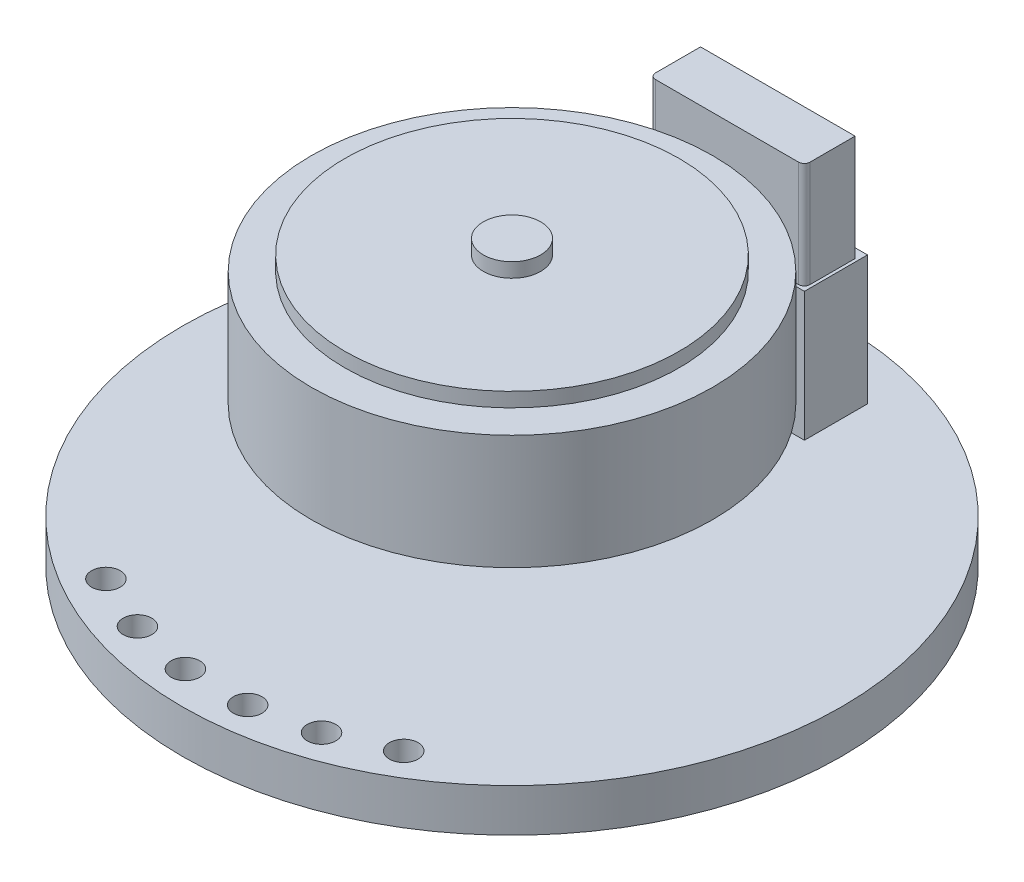
ISO-10303-21;
HEADER;
FILE_DESCRIPTION(('STEP AP214'),'2;1');
FILE_NAME('part.step','',(''),(''),'','','');
FILE_SCHEMA(('AUTOMOTIVE_DESIGN { 1 0 10303 214 1 1 1 1 }'));
ENDSEC;
DATA;
#1=APPLICATION_CONTEXT('core data for automotive mechanical design processes');
#2=APPLICATION_PROTOCOL_DEFINITION('international standard','automotive_design',2000,#1);
#3=PRODUCT_CONTEXT('',#1,'mechanical');
#4=PRODUCT('Part','Part','',(#3));
#5=PRODUCT_RELATED_PRODUCT_CATEGORY('part','',(#4));
#6=PRODUCT_DEFINITION_FORMATION('','',#4);
#7=PRODUCT_DEFINITION_CONTEXT('part definition',#1,'design');
#8=PRODUCT_DEFINITION('design','',#6,#7);
#9=PRODUCT_DEFINITION_SHAPE('','',#8);
#10=(LENGTH_UNIT() NAMED_UNIT(*) SI_UNIT(.MILLI.,.METRE.));
#11=(NAMED_UNIT(*) PLANE_ANGLE_UNIT() SI_UNIT($,.RADIAN.));
#12=(NAMED_UNIT(*) SI_UNIT($,.STERADIAN.) SOLID_ANGLE_UNIT());
#13=UNCERTAINTY_MEASURE_WITH_UNIT(LENGTH_MEASURE(1.E-05),#10,'distance_accuracy_value','');
#14=(GEOMETRIC_REPRESENTATION_CONTEXT(3) GLOBAL_UNCERTAINTY_ASSIGNED_CONTEXT((#13)) GLOBAL_UNIT_ASSIGNED_CONTEXT((#10,
#11,#12)) REPRESENTATION_CONTEXT('',''));
#15=CARTESIAN_POINT('',(0.,0.,0.));
#16=DIRECTION('',(0.,0.,1.));
#17=DIRECTION('',(1.,0.,0.));
#18=AXIS2_PLACEMENT_3D('',#15,#16,#17);
#19=CARTESIAN_POINT('',(0.,9.4,0.));
#20=DIRECTION('',(0.,1.,0.));
#21=DIRECTION('',(0.,0.,1.));
#22=AXIS2_PLACEMENT_3D('',#19,#20,#21);
#23=PLANE('',#22);
#24=CARTESIAN_POINT('',(0.,9.4,0.));
#25=DIRECTION('',(0.,1.,0.));
#26=DIRECTION('',(0.,0.,1.));
#27=AXIS2_PLACEMENT_3D('',#24,#25,#26);
#28=CIRCLE('',#27,5.83000214825466);
#29=CARTESIAN_POINT('',(0.,9.4,5.83000214825466));
#30=VERTEX_POINT('',#29);
#31=EDGE_CURVE('E335',#30,#30,#28,.T.);
#32=ORIENTED_EDGE('',*,*,#31,.T.);
#33=EDGE_LOOP('',(#32));
#34=FACE_BOUND('',#33,.T.);
#35=CARTESIAN_POINT('',(0.,9.4,0.));
#36=DIRECTION('',(0.,1.,0.));
#37=DIRECTION('',(0.,0.,1.));
#38=AXIS2_PLACEMENT_3D('',#35,#36,#37);
#39=CIRCLE('',#38,1.);
#40=CARTESIAN_POINT('',(0.,9.4,1.));
#41=VERTEX_POINT('',#40);
#42=EDGE_CURVE('E342',#41,#41,#39,.T.);
#43=ORIENTED_EDGE('',*,*,#42,.F.);
#44=EDGE_LOOP('',(#43));
#45=FACE_BOUND('',#44,.T.);
#46=ADVANCED_FACE('F35',(#34,#45),#23,.T.);
#47=CARTESIAN_POINT('',(0.,8.9,0.));
#48=DIRECTION('',(0.,1.,0.));
#49=DIRECTION('',(0.,0.,1.));
#50=AXIS2_PLACEMENT_3D('',#47,#48,#49);
#51=PLANE('',#50);
#52=CARTESIAN_POINT('',(0.,8.9,0.));
#53=DIRECTION('',(0.,1.,0.));
#54=DIRECTION('',(0.,0.,1.));
#55=AXIS2_PLACEMENT_3D('',#52,#53,#54);
#56=CIRCLE('',#55,7.);
#57=CARTESIAN_POINT('',(0.,8.9,7.));
#58=VERTEX_POINT('',#57);
#59=EDGE_CURVE('E294',#58,#58,#56,.T.);
#60=ORIENTED_EDGE('',*,*,#59,.T.);
#61=EDGE_LOOP('',(#60));
#62=FACE_BOUND('',#61,.T.);
#63=CARTESIAN_POINT('',(0.,8.9,0.));
#64=DIRECTION('',(0.,1.,0.));
#65=DIRECTION('',(0.,0.,1.));
#66=AXIS2_PLACEMENT_3D('',#63,#64,#65);
#67=CIRCLE('',#66,5.83000214825466);
#68=CARTESIAN_POINT('',(0.,8.9,5.83000214825466));
#69=VERTEX_POINT('',#68);
#70=EDGE_CURVE('E337',#69,#69,#67,.T.);
#71=ORIENTED_EDGE('',*,*,#70,.F.);
#72=EDGE_LOOP('',(#71));
#73=FACE_BOUND('',#72,.T.);
#74=ADVANCED_FACE('F192',(#62,#73),#51,.T.);
#75=CARTESIAN_POINT('',(0.,1.5,0.));
#76=DIRECTION('',(0.,1.,0.));
#77=DIRECTION('',(0.,0.,1.));
#78=AXIS2_PLACEMENT_3D('',#75,#76,#77);
#79=PLANE('',#78);
#80=CARTESIAN_POINT('',(-5.19421202389019,1.5,8.97040407815014));
#81=DIRECTION('',(0.,1.,0.));
#82=DIRECTION('',(0.,0.,1.));
#83=AXIS2_PLACEMENT_3D('',#80,#81,#82);
#84=CIRCLE('',#83,0.500000000000002);
#85=CARTESIAN_POINT('',(-5.19421202389019,1.5,9.47040407815014));
#86=VERTEX_POINT('',#85);
#87=EDGE_CURVE('E262',#86,#86,#84,.T.);
#88=ORIENTED_EDGE('',*,*,#87,.F.);
#89=EDGE_LOOP('',(#88));
#90=FACE_BOUND('',#89,.T.);
#91=CARTESIAN_POINT('',(-3.21019957553751,1.5,9.85374333216596));
#92=DIRECTION('',(0.,1.,0.));
#93=DIRECTION('',(0.,0.,1.));
#94=AXIS2_PLACEMENT_3D('',#91,#92,#93);
#95=CIRCLE('',#94,0.5);
#96=CARTESIAN_POINT('',(-3.21019957553751,1.5,10.353743332166));
#97=VERTEX_POINT('',#96);
#98=EDGE_CURVE('E266',#97,#97,#95,.T.);
#99=ORIENTED_EDGE('',*,*,#98,.F.);
#100=EDGE_LOOP('',(#99));
#101=FACE_BOUND('',#100,.T.);
#102=CARTESIAN_POINT('',(-1.08588600148721,1.5,10.305280121375));
#103=DIRECTION('',(0.,1.,0.));
#104=DIRECTION('',(0.,0.,1.));
#105=AXIS2_PLACEMENT_3D('',#102,#103,#104);
#106=CIRCLE('',#105,0.500000000000008);
#107=CARTESIAN_POINT('',(-1.08588600148721,1.5,10.8052801213751));
#108=VERTEX_POINT('',#107);
#109=EDGE_CURVE('E270',#108,#108,#106,.T.);
#110=ORIENTED_EDGE('',*,*,#109,.F.);
#111=EDGE_LOOP('',(#110));
#112=FACE_BOUND('',#111,.T.);
#113=CARTESIAN_POINT('',(1.08588600148721,1.5,10.3052801213751));
#114=DIRECTION('',(0.,1.,0.));
#115=DIRECTION('',(0.,0.,1.));
#116=AXIS2_PLACEMENT_3D('',#113,#114,#115);
#117=CIRCLE('',#116,0.500000000000034);
#118=CARTESIAN_POINT('',(1.08588600148721,1.5,10.8052801213751));
#119=VERTEX_POINT('',#118);
#120=EDGE_CURVE('E274',#119,#119,#117,.T.);
#121=ORIENTED_EDGE('',*,*,#120,.F.);
#122=EDGE_LOOP('',(#121));
#123=FACE_BOUND('',#122,.T.);
#124=CARTESIAN_POINT('',(3.21019957553754,1.5,9.85374333216591));
#125=DIRECTION('',(0.,1.,0.));
#126=DIRECTION('',(0.,0.,1.));
#127=AXIS2_PLACEMENT_3D('',#124,#125,#126);
#128=CIRCLE('',#127,0.5);
#129=CARTESIAN_POINT('',(3.21019957553754,1.5,10.3537433321659));
#130=VERTEX_POINT('',#129);
#131=EDGE_CURVE('E278',#130,#130,#128,.T.);
#132=ORIENTED_EDGE('',*,*,#131,.F.);
#133=EDGE_LOOP('',(#132));
#134=FACE_BOUND('',#133,.T.);
#135=CARTESIAN_POINT('',(5.19421202389015,1.5,8.97040407815016));
#136=DIRECTION('',(0.,1.,0.));
#137=DIRECTION('',(0.,0.,1.));
#138=AXIS2_PLACEMENT_3D('',#135,#136,#137);
#139=CIRCLE('',#138,0.500000000000079);
#140=CARTESIAN_POINT('',(5.19421202389015,1.5,9.47040407815024));
#141=VERTEX_POINT('',#140);
#142=EDGE_CURVE('E282',#141,#141,#139,.T.);
#143=ORIENTED_EDGE('',*,*,#142,.F.);
#144=EDGE_LOOP('',(#143));
#145=FACE_BOUND('',#144,.T.);
#146=DIRECTION('',(-1.,0.,0.));
#147=VECTOR('',#146,1.);
#148=CARTESIAN_POINT('',(-2.8,1.5,-9.6));
#149=LINE('',#148,#147);
#150=CARTESIAN_POINT('',(2.8,1.5,-9.6));
#151=VERTEX_POINT('',#150);
#152=CARTESIAN_POINT('',(-2.8,1.5,-9.6));
#153=VERTEX_POINT('',#152);
#154=EDGE_CURVE('E141',#151,#153,#149,.T.);
#155=ORIENTED_EDGE('',*,*,#154,.F.);
#156=DIRECTION('',(0.,0.,-1.));
#157=VECTOR('',#156,1.);
#158=CARTESIAN_POINT('',(2.8,1.5,-9.6));
#159=LINE('',#158,#157);
#160=CARTESIAN_POINT('',(2.8,1.5,-7.4));
#161=VERTEX_POINT('',#160);
#162=EDGE_CURVE('E138',#161,#151,#159,.T.);
#163=ORIENTED_EDGE('',*,*,#162,.F.);
#164=DIRECTION('',(1.,0.,0.));
#165=VECTOR('',#164,1.);
#166=CARTESIAN_POINT('',(-2.8,1.5,-7.4));
#167=LINE('',#166,#165);
#168=CARTESIAN_POINT('',(-2.8,1.5,-7.4));
#169=VERTEX_POINT('',#168);
#170=EDGE_CURVE('E151',#169,#161,#167,.T.);
#171=ORIENTED_EDGE('',*,*,#170,.F.);
#172=DIRECTION('',(0.,0.,1.));
#173=VECTOR('',#172,1.);
#174=CARTESIAN_POINT('',(-2.8,1.5,-9.6));
#175=LINE('',#174,#173);
#176=EDGE_CURVE('E159',#153,#169,#175,.T.);
#177=ORIENTED_EDGE('',*,*,#176,.F.);
#178=EDGE_LOOP('',(#155,#163,#171,#177));
#179=FACE_BOUND('',#178,.T.);
#180=CARTESIAN_POINT('',(0.,1.5,0.));
#181=DIRECTION('',(0.,1.,0.));
#182=DIRECTION('',(0.,0.,1.));
#183=AXIS2_PLACEMENT_3D('',#180,#181,#182);
#184=CIRCLE('',#183,11.5);
#185=CARTESIAN_POINT('',(0.,1.5,11.5));
#186=VERTEX_POINT('',#185);
#187=EDGE_CURVE('E11',#186,#186,#184,.T.);
#188=ORIENTED_EDGE('',*,*,#187,.T.);
#189=EDGE_LOOP('',(#188));
#190=FACE_BOUND('',#189,.T.);
#191=CARTESIAN_POINT('',(0.,1.5,0.));
#192=DIRECTION('',(0.,1.,0.));
#193=DIRECTION('',(0.,0.,1.));
#194=AXIS2_PLACEMENT_3D('',#191,#192,#193);
#195=CIRCLE('',#194,1.);
#196=CARTESIAN_POINT('',(0.,1.5,1.));
#197=VERTEX_POINT('',#196);
#198=EDGE_CURVE('E291',#197,#197,#195,.T.);
#199=ORIENTED_EDGE('',*,*,#198,.F.);
#200=EDGE_LOOP('',(#199));
#201=FACE_BOUND('',#200,.T.);
#202=ADVANCED_FACE('F198',(#90,#101,#112,#123,#134,#145,#179,#190,#201),#79,.T.);
#203=CARTESIAN_POINT('',(0.,6.,0.));
#204=DIRECTION('',(0.,1.,0.));
#205=DIRECTION('',(0.,0.,1.));
#206=AXIS2_PLACEMENT_3D('',#203,#204,#205);
#207=PLANE('',#206);
#208=DIRECTION('',(0.,0.,-1.));
#209=VECTOR('',#208,1.);
#210=CARTESIAN_POINT('',(2.8,6.,-9.6));
#211=LINE('',#210,#209);
#212=CARTESIAN_POINT('',(2.8,6.,-7.4));
#213=VERTEX_POINT('',#212);
#214=CARTESIAN_POINT('',(2.8,6.,-9.6));
#215=VERTEX_POINT('',#214);
#216=EDGE_CURVE('E147',#213,#215,#211,.T.);
#217=ORIENTED_EDGE('',*,*,#216,.T.);
#218=DIRECTION('',(-1.,0.,0.));
#219=VECTOR('',#218,1.);
#220=CARTESIAN_POINT('',(-2.8,6.,-9.6));
#221=LINE('',#220,#219);
#222=CARTESIAN_POINT('',(-2.8,6.,-9.6));
#223=VERTEX_POINT('',#222);
#224=EDGE_CURVE('E150',#215,#223,#221,.T.);
#225=ORIENTED_EDGE('',*,*,#224,.T.);
#226=DIRECTION('',(0.,0.,1.));
#227=VECTOR('',#226,1.);
#228=CARTESIAN_POINT('',(-2.8,6.,-9.6));
#229=LINE('',#228,#227);
#230=CARTESIAN_POINT('',(-2.8,6.,-7.4));
#231=VERTEX_POINT('',#230);
#232=EDGE_CURVE('E153',#223,#231,#229,.T.);
#233=ORIENTED_EDGE('',*,*,#232,.T.);
#234=DIRECTION('',(1.,0.,0.));
#235=VECTOR('',#234,1.);
#236=CARTESIAN_POINT('',(-2.8,6.,-7.4));
#237=LINE('',#236,#235);
#238=EDGE_CURVE('E155',#231,#213,#237,.T.);
#239=ORIENTED_EDGE('',*,*,#238,.T.);
#240=EDGE_LOOP('',(#217,#225,#233,#239));
#241=FACE_BOUND('',#240,.T.);
#242=CARTESIAN_POINT('',(-2.49514699365122,6.,-7.7));
#243=DIRECTION('',(0.,1.,0.));
#244=DIRECTION('',(0.,0.,1.));
#245=AXIS2_PLACEMENT_3D('',#242,#243,#244);
#246=CIRCLE('',#245,0.2);
#247=CARTESIAN_POINT('',(-2.69514699365122,6.,-7.7));
#248=VERTEX_POINT('',#247);
#249=CARTESIAN_POINT('',(-2.49514699365122,6.,-7.5));
#250=VERTEX_POINT('',#249);
#251=EDGE_CURVE('E311',#248,#250,#246,.T.);
#252=ORIENTED_EDGE('',*,*,#251,.F.);
#253=DIRECTION('',(0.,0.,1.));
#254=VECTOR('',#253,1.);
#255=CARTESIAN_POINT('',(-2.69514699365122,6.,-9.27152586413851));
#256=LINE('',#255,#254);
#257=CARTESIAN_POINT('',(-2.69514699365122,6.,-9.27152586413851));
#258=VERTEX_POINT('',#257);
#259=EDGE_CURVE('E136',#258,#248,#256,.T.);
#260=ORIENTED_EDGE('',*,*,#259,.F.);
#261=DIRECTION('',(-1.,0.,0.));
#262=VECTOR('',#261,1.);
#263=CARTESIAN_POINT('',(-2.69514699365122,6.,-9.27152586413851));
#264=LINE('',#263,#262);
#265=CARTESIAN_POINT('',(2.69514699365121,6.,-9.27152586413851));
#266=VERTEX_POINT('',#265);
#267=EDGE_CURVE('E132',#266,#258,#264,.T.);
#268=ORIENTED_EDGE('',*,*,#267,.F.);
#269=DIRECTION('',(0.,0.,-1.));
#270=VECTOR('',#269,1.);
#271=CARTESIAN_POINT('',(2.69514699365121,6.,-9.27152586413851));
#272=LINE('',#271,#270);
#273=CARTESIAN_POINT('',(2.69514699365121,6.,-7.7));
#274=VERTEX_POINT('',#273);
#275=EDGE_CURVE('E317',#274,#266,#272,.T.);
#276=ORIENTED_EDGE('',*,*,#275,.F.);
#277=CARTESIAN_POINT('',(2.49514699365121,6.,-7.7));
#278=DIRECTION('',(0.,1.,0.));
#279=DIRECTION('',(0.,0.,1.));
#280=AXIS2_PLACEMENT_3D('',#277,#278,#279);
#281=CIRCLE('',#280,0.2);
#282=CARTESIAN_POINT('',(2.49514699365121,6.,-7.5));
#283=VERTEX_POINT('',#282);
#284=EDGE_CURVE('E315',#283,#274,#281,.T.);
#285=ORIENTED_EDGE('',*,*,#284,.F.);
#286=DIRECTION('',(1.,0.,0.));
#287=VECTOR('',#286,1.);
#288=CARTESIAN_POINT('',(-2.49514699365122,6.,-7.5));
#289=LINE('',#288,#287);
#290=EDGE_CURVE('E313',#250,#283,#289,.T.);
#291=ORIENTED_EDGE('',*,*,#290,.F.);
#292=EDGE_LOOP('',(#252,#260,#268,#276,#285,#291));
#293=FACE_BOUND('',#292,.T.);
#294=ADVANCED_FACE('F186',(#241,#293),#207,.T.);
#295=CARTESIAN_POINT('',(0.,1.5,0.));
#296=DIRECTION('',(0.,-1.,0.));
#297=DIRECTION('',(0.,0.,-1.));
#298=AXIS2_PLACEMENT_3D('',#295,#296,#297);
#299=CYLINDRICAL_SURFACE('',#298,11.5);
#300=ORIENTED_EDGE('',*,*,#187,.F.);
#301=EDGE_LOOP('',(#300));
#302=FACE_BOUND('',#301,.T.);
#303=CARTESIAN_POINT('',(0.,0.,0.));
#304=DIRECTION('',(0.,1.,0.));
#305=DIRECTION('',(0.,0.,1.));
#306=AXIS2_PLACEMENT_3D('',#303,#304,#305);
#307=CIRCLE('',#306,11.5);
#308=CARTESIAN_POINT('',(0.,0.,11.5));
#309=VERTEX_POINT('',#308);
#310=EDGE_CURVE('E39',#309,#309,#307,.T.);
#311=ORIENTED_EDGE('',*,*,#310,.T.);
#312=EDGE_LOOP('',(#311));
#313=FACE_BOUND('',#312,.T.);
#314=ADVANCED_FACE('F37',(#302,#313),#299,.T.);
#315=CARTESIAN_POINT('',(0.,0.,0.));
#316=DIRECTION('',(0.,1.,0.));
#317=DIRECTION('',(0.,0.,1.));
#318=AXIS2_PLACEMENT_3D('',#315,#316,#317);
#319=PLANE('',#318);
#320=CARTESIAN_POINT('',(-5.19421202389019,0.,8.97040407815014));
#321=DIRECTION('',(0.,1.,0.));
#322=DIRECTION('',(0.,0.,1.));
#323=AXIS2_PLACEMENT_3D('',#320,#321,#322);
#324=CIRCLE('',#323,0.500000000000002);
#325=CARTESIAN_POINT('',(-5.19421202389019,0.,9.47040407815014));
#326=VERTEX_POINT('',#325);
#327=EDGE_CURVE('E365',#326,#326,#324,.T.);
#328=ORIENTED_EDGE('',*,*,#327,.T.);
#329=EDGE_LOOP('',(#328));
#330=FACE_BOUND('',#329,.T.);
#331=CARTESIAN_POINT('',(-3.21019957553751,0.,9.85374333216596));
#332=DIRECTION('',(0.,1.,0.));
#333=DIRECTION('',(0.,0.,1.));
#334=AXIS2_PLACEMENT_3D('',#331,#332,#333);
#335=CIRCLE('',#334,0.5);
#336=CARTESIAN_POINT('',(-3.21019957553751,0.,10.353743332166));
#337=VERTEX_POINT('',#336);
#338=EDGE_CURVE('E361',#337,#337,#335,.T.);
#339=ORIENTED_EDGE('',*,*,#338,.T.);
#340=EDGE_LOOP('',(#339));
#341=FACE_BOUND('',#340,.T.);
#342=CARTESIAN_POINT('',(-1.08588600148721,0.,10.305280121375));
#343=DIRECTION('',(0.,1.,0.));
#344=DIRECTION('',(0.,0.,1.));
#345=AXIS2_PLACEMENT_3D('',#342,#343,#344);
#346=CIRCLE('',#345,0.500000000000008);
#347=CARTESIAN_POINT('',(-1.08588600148721,0.,10.8052801213751));
#348=VERTEX_POINT('',#347);
#349=EDGE_CURVE('E357',#348,#348,#346,.T.);
#350=ORIENTED_EDGE('',*,*,#349,.T.);
#351=EDGE_LOOP('',(#350));
#352=FACE_BOUND('',#351,.T.);
#353=CARTESIAN_POINT('',(1.08588600148721,0.,10.3052801213751));
#354=DIRECTION('',(0.,1.,0.));
#355=DIRECTION('',(0.,0.,1.));
#356=AXIS2_PLACEMENT_3D('',#353,#354,#355);
#357=CIRCLE('',#356,0.500000000000034);
#358=CARTESIAN_POINT('',(1.08588600148721,0.,10.8052801213751));
#359=VERTEX_POINT('',#358);
#360=EDGE_CURVE('E353',#359,#359,#357,.T.);
#361=ORIENTED_EDGE('',*,*,#360,.T.);
#362=EDGE_LOOP('',(#361));
#363=FACE_BOUND('',#362,.T.);
#364=CARTESIAN_POINT('',(3.21019957553754,0.,9.85374333216591));
#365=DIRECTION('',(0.,1.,0.));
#366=DIRECTION('',(0.,0.,1.));
#367=AXIS2_PLACEMENT_3D('',#364,#365,#366);
#368=CIRCLE('',#367,0.5);
#369=CARTESIAN_POINT('',(3.21019957553754,0.,10.3537433321659));
#370=VERTEX_POINT('',#369);
#371=EDGE_CURVE('E349',#370,#370,#368,.T.);
#372=ORIENTED_EDGE('',*,*,#371,.T.);
#373=EDGE_LOOP('',(#372));
#374=FACE_BOUND('',#373,.T.);
#375=CARTESIAN_POINT('',(5.19421202389015,0.,8.97040407815016));
#376=DIRECTION('',(0.,1.,0.));
#377=DIRECTION('',(0.,0.,1.));
#378=AXIS2_PLACEMENT_3D('',#375,#376,#377);
#379=CIRCLE('',#378,0.500000000000079);
#380=CARTESIAN_POINT('',(5.19421202389015,0.,9.47040407815024));
#381=VERTEX_POINT('',#380);
#382=EDGE_CURVE('E345',#381,#381,#379,.T.);
#383=ORIENTED_EDGE('',*,*,#382,.T.);
#384=EDGE_LOOP('',(#383));
#385=FACE_BOUND('',#384,.T.);
#386=ORIENTED_EDGE('',*,*,#310,.F.);
#387=EDGE_LOOP('',(#386));
#388=FACE_BOUND('',#387,.T.);
#389=ADVANCED_FACE('F175',(#330,#341,#352,#363,#374,#385,#388),#319,.F.);
#390=CARTESIAN_POINT('',(2.8,6.,-9.6));
#391=DIRECTION('',(-1.,0.,0.));
#392=DIRECTION('',(0.,0.,1.));
#393=AXIS2_PLACEMENT_3D('',#390,#391,#392);
#394=PLANE('',#393);
#395=ORIENTED_EDGE('',*,*,#162,.T.);
#396=DIRECTION('',(0.,-1.,0.));
#397=VECTOR('',#396,1.);
#398=CARTESIAN_POINT('',(2.8,6.,-9.6));
#399=LINE('',#398,#397);
#400=EDGE_CURVE('E168',#215,#151,#399,.T.);
#401=ORIENTED_EDGE('',*,*,#400,.F.);
#402=ORIENTED_EDGE('',*,*,#216,.F.);
#403=DIRECTION('',(0.,-1.,0.));
#404=VECTOR('',#403,1.);
#405=CARTESIAN_POINT('',(2.8,6.,-7.4));
#406=LINE('',#405,#404);
#407=EDGE_CURVE('E156',#213,#161,#406,.T.);
#408=ORIENTED_EDGE('',*,*,#407,.T.);
#409=EDGE_LOOP('',(#395,#401,#402,#408));
#410=FACE_BOUND('',#409,.T.);
#411=ADVANCED_FACE('F177',(#410),#394,.F.);
#412=CARTESIAN_POINT('',(-2.8,6.,-9.6));
#413=DIRECTION('',(0.,0.,1.));
#414=DIRECTION('',(1.,0.,0.));
#415=AXIS2_PLACEMENT_3D('',#412,#413,#414);
#416=PLANE('',#415);
#417=ORIENTED_EDGE('',*,*,#154,.T.);
#418=DIRECTION('',(0.,-1.,0.));
#419=VECTOR('',#418,1.);
#420=CARTESIAN_POINT('',(-2.8,6.,-9.6));
#421=LINE('',#420,#419);
#422=EDGE_CURVE('E165',#223,#153,#421,.T.);
#423=ORIENTED_EDGE('',*,*,#422,.F.);
#424=ORIENTED_EDGE('',*,*,#224,.F.);
#425=ORIENTED_EDGE('',*,*,#400,.T.);
#426=EDGE_LOOP('',(#417,#423,#424,#425));
#427=FACE_BOUND('',#426,.T.);
#428=ADVANCED_FACE('F183',(#427),#416,.F.);
#429=CARTESIAN_POINT('',(-2.8,6.,-9.6));
#430=DIRECTION('',(1.,0.,0.));
#431=DIRECTION('',(0.,0.,-1.));
#432=AXIS2_PLACEMENT_3D('',#429,#430,#431);
#433=PLANE('',#432);
#434=ORIENTED_EDGE('',*,*,#176,.T.);
#435=DIRECTION('',(0.,-1.,0.));
#436=VECTOR('',#435,1.);
#437=CARTESIAN_POINT('',(-2.8,6.,-7.4));
#438=LINE('',#437,#436);
#439=EDGE_CURVE('E58',#231,#169,#438,.T.);
#440=ORIENTED_EDGE('',*,*,#439,.F.);
#441=ORIENTED_EDGE('',*,*,#232,.F.);
#442=ORIENTED_EDGE('',*,*,#422,.T.);
#443=EDGE_LOOP('',(#434,#440,#441,#442));
#444=FACE_BOUND('',#443,.T.);
#445=ADVANCED_FACE('F250',(#444),#433,.F.);
#446=CARTESIAN_POINT('',(-2.8,6.,-7.4));
#447=DIRECTION('',(0.,0.,-1.));
#448=DIRECTION('',(-1.,0.,0.));
#449=AXIS2_PLACEMENT_3D('',#446,#447,#448);
#450=PLANE('',#449);
#451=ORIENTED_EDGE('',*,*,#170,.T.);
#452=ORIENTED_EDGE('',*,*,#407,.F.);
#453=ORIENTED_EDGE('',*,*,#238,.F.);
#454=ORIENTED_EDGE('',*,*,#439,.T.);
#455=EDGE_LOOP('',(#451,#452,#453,#454));
#456=FACE_BOUND('',#455,.T.);
#457=ADVANCED_FACE('F244',(#456),#450,.F.);
#458=CARTESIAN_POINT('',(-2.69514699365122,9.7,-9.27152586413851));
#459=DIRECTION('',(1.,0.,0.));
#460=DIRECTION('',(0.,0.,-1.));
#461=AXIS2_PLACEMENT_3D('',#458,#459,#460);
#462=PLANE('',#461);
#463=ORIENTED_EDGE('',*,*,#259,.T.);
#464=DIRECTION('',(0.,-1.,0.));
#465=VECTOR('',#464,1.);
#466=CARTESIAN_POINT('',(-2.69514699365122,9.7,-7.7));
#467=LINE('',#466,#465);
#468=CARTESIAN_POINT('',(-2.69514699365122,9.7,-7.7));
#469=VERTEX_POINT('',#468);
#470=EDGE_CURVE('E117',#469,#248,#467,.T.);
#471=ORIENTED_EDGE('',*,*,#470,.F.);
#472=DIRECTION('',(0.,0.,1.));
#473=VECTOR('',#472,1.);
#474=CARTESIAN_POINT('',(-2.69514699365122,9.7,-9.27152586413851));
#475=LINE('',#474,#473);
#476=CARTESIAN_POINT('',(-2.69514699365122,9.7,-9.27152586413851));
#477=VERTEX_POINT('',#476);
#478=EDGE_CURVE('E124',#477,#469,#475,.T.);
#479=ORIENTED_EDGE('',*,*,#478,.F.);
#480=DIRECTION('',(0.,-1.,0.));
#481=VECTOR('',#480,1.);
#482=CARTESIAN_POINT('',(-2.69514699365122,9.7,-9.27152586413851));
#483=LINE('',#482,#481);
#484=EDGE_CURVE('E309',#477,#258,#483,.T.);
#485=ORIENTED_EDGE('',*,*,#484,.T.);
#486=EDGE_LOOP('',(#463,#471,#479,#485));
#487=FACE_BOUND('',#486,.T.);
#488=ADVANCED_FACE('F134',(#487),#462,.F.);
#489=CARTESIAN_POINT('',(-2.49514699365122,9.7,-7.7));
#490=DIRECTION('',(0.,-1.,0.));
#491=DIRECTION('',(0.,0.,-1.));
#492=AXIS2_PLACEMENT_3D('',#489,#490,#491);
#493=CYLINDRICAL_SURFACE('',#492,0.2);
#494=ORIENTED_EDGE('',*,*,#251,.T.);
#495=DIRECTION('',(0.,-1.,0.));
#496=VECTOR('',#495,1.);
#497=CARTESIAN_POINT('',(-2.49514699365122,9.7,-7.5));
#498=LINE('',#497,#496);
#499=CARTESIAN_POINT('',(-2.49514699365122,9.7,-7.5));
#500=VERTEX_POINT('',#499);
#501=EDGE_CURVE('E120',#500,#250,#498,.T.);
#502=ORIENTED_EDGE('',*,*,#501,.F.);
#503=CARTESIAN_POINT('',(-2.49514699365122,9.7,-7.7));
#504=DIRECTION('',(0.,1.,0.));
#505=DIRECTION('',(0.,0.,1.));
#506=AXIS2_PLACEMENT_3D('',#503,#504,#505);
#507=CIRCLE('',#506,0.2);
#508=EDGE_CURVE('E113',#469,#500,#507,.T.);
#509=ORIENTED_EDGE('',*,*,#508,.F.);
#510=ORIENTED_EDGE('',*,*,#470,.T.);
#511=EDGE_LOOP('',(#494,#502,#509,#510));
#512=FACE_BOUND('',#511,.T.);
#513=ADVANCED_FACE('F115',(#512),#493,.T.);
#514=CARTESIAN_POINT('',(-2.49514699365122,9.7,-7.5));
#515=DIRECTION('',(0.,0.,-1.));
#516=DIRECTION('',(-1.,0.,0.));
#517=AXIS2_PLACEMENT_3D('',#514,#515,#516);
#518=PLANE('',#517);
#519=ORIENTED_EDGE('',*,*,#290,.T.);
#520=DIRECTION('',(0.,-1.,0.));
#521=VECTOR('',#520,1.);
#522=CARTESIAN_POINT('',(2.49514699365121,9.7,-7.5));
#523=LINE('',#522,#521);
#524=CARTESIAN_POINT('',(2.49514699365121,9.7,-7.5));
#525=VERTEX_POINT('',#524);
#526=EDGE_CURVE('E143',#525,#283,#523,.T.);
#527=ORIENTED_EDGE('',*,*,#526,.F.);
#528=DIRECTION('',(1.,0.,0.));
#529=VECTOR('',#528,1.);
#530=CARTESIAN_POINT('',(-2.49514699365122,9.7,-7.5));
#531=LINE('',#530,#529);
#532=EDGE_CURVE('E123',#500,#525,#531,.T.);
#533=ORIENTED_EDGE('',*,*,#532,.F.);
#534=ORIENTED_EDGE('',*,*,#501,.T.);
#535=EDGE_LOOP('',(#519,#527,#533,#534));
#536=FACE_BOUND('',#535,.T.);
#537=ADVANCED_FACE('F235',(#536),#518,.F.);
#538=CARTESIAN_POINT('',(2.49514699365121,9.7,-7.7));
#539=DIRECTION('',(0.,-1.,0.));
#540=DIRECTION('',(0.,0.,-1.));
#541=AXIS2_PLACEMENT_3D('',#538,#539,#540);
#542=CYLINDRICAL_SURFACE('',#541,0.2);
#543=ORIENTED_EDGE('',*,*,#284,.T.);
#544=DIRECTION('',(0.,-1.,0.));
#545=VECTOR('',#544,1.);
#546=CARTESIAN_POINT('',(2.69514699365121,9.7,-7.7));
#547=LINE('',#546,#545);
#548=CARTESIAN_POINT('',(2.69514699365121,9.7,-7.7));
#549=VERTEX_POINT('',#548);
#550=EDGE_CURVE('E322',#549,#274,#547,.T.);
#551=ORIENTED_EDGE('',*,*,#550,.F.);
#552=CARTESIAN_POINT('',(2.49514699365121,9.7,-7.7));
#553=DIRECTION('',(0.,1.,0.));
#554=DIRECTION('',(0.,0.,1.));
#555=AXIS2_PLACEMENT_3D('',#552,#553,#554);
#556=CIRCLE('',#555,0.2);
#557=EDGE_CURVE('E304',#525,#549,#556,.T.);
#558=ORIENTED_EDGE('',*,*,#557,.F.);
#559=ORIENTED_EDGE('',*,*,#526,.T.);
#560=EDGE_LOOP('',(#543,#551,#558,#559));
#561=FACE_BOUND('',#560,.T.);
#562=ADVANCED_FACE('F231',(#561),#542,.T.);
#563=CARTESIAN_POINT('',(2.69514699365121,9.7,-9.27152586413851));
#564=DIRECTION('',(-1.,0.,0.));
#565=DIRECTION('',(0.,0.,1.));
#566=AXIS2_PLACEMENT_3D('',#563,#564,#565);
#567=PLANE('',#566);
#568=ORIENTED_EDGE('',*,*,#275,.T.);
#569=DIRECTION('',(0.,-1.,0.));
#570=VECTOR('',#569,1.);
#571=CARTESIAN_POINT('',(2.69514699365121,9.7,-9.27152586413851));
#572=LINE('',#571,#570);
#573=CARTESIAN_POINT('',(2.69514699365121,9.7,-9.27152586413851));
#574=VERTEX_POINT('',#573);
#575=EDGE_CURVE('E50',#574,#266,#572,.T.);
#576=ORIENTED_EDGE('',*,*,#575,.F.);
#577=DIRECTION('',(0.,0.,-1.));
#578=VECTOR('',#577,1.);
#579=CARTESIAN_POINT('',(2.69514699365121,9.7,-9.27152586413851));
#580=LINE('',#579,#578);
#581=EDGE_CURVE('E306',#549,#574,#580,.T.);
#582=ORIENTED_EDGE('',*,*,#581,.F.);
#583=ORIENTED_EDGE('',*,*,#550,.T.);
#584=EDGE_LOOP('',(#568,#576,#582,#583));
#585=FACE_BOUND('',#584,.T.);
#586=ADVANCED_FACE('F228',(#585),#567,.F.);
#587=CARTESIAN_POINT('',(-2.69514699365122,9.7,-9.27152586413851));
#588=DIRECTION('',(0.,0.,1.));
#589=DIRECTION('',(1.,0.,0.));
#590=AXIS2_PLACEMENT_3D('',#587,#588,#589);
#591=PLANE('',#590);
#592=ORIENTED_EDGE('',*,*,#267,.T.);
#593=ORIENTED_EDGE('',*,*,#484,.F.);
#594=DIRECTION('',(-1.,0.,0.));
#595=VECTOR('',#594,1.);
#596=CARTESIAN_POINT('',(-2.69514699365122,9.7,-9.27152586413851));
#597=LINE('',#596,#595);
#598=EDGE_CURVE('E128',#574,#477,#597,.T.);
#599=ORIENTED_EDGE('',*,*,#598,.F.);
#600=ORIENTED_EDGE('',*,*,#575,.T.);
#601=EDGE_LOOP('',(#592,#593,#599,#600));
#602=FACE_BOUND('',#601,.T.);
#603=ADVANCED_FACE('F225',(#602),#591,.F.);
#604=CARTESIAN_POINT('',(-2.49514699365122,9.7,-7.7));
#605=DIRECTION('',(0.,1.,0.));
#606=DIRECTION('',(0.,0.,1.));
#607=AXIS2_PLACEMENT_3D('',#604,#605,#606);
#608=PLANE('',#607);
#609=ORIENTED_EDGE('',*,*,#478,.T.);
#610=ORIENTED_EDGE('',*,*,#508,.T.);
#611=ORIENTED_EDGE('',*,*,#532,.T.);
#612=ORIENTED_EDGE('',*,*,#557,.T.);
#613=ORIENTED_EDGE('',*,*,#581,.T.);
#614=ORIENTED_EDGE('',*,*,#598,.T.);
#615=EDGE_LOOP('',(#609,#610,#611,#612,#613,#614));
#616=FACE_BOUND('',#615,.T.);
#617=ADVANCED_FACE('F127',(#616),#608,.T.);
#618=CARTESIAN_POINT('',(0.,4.9,0.));
#619=DIRECTION('',(0.,-1.,0.));
#620=DIRECTION('',(0.,0.,-1.));
#621=AXIS2_PLACEMENT_3D('',#618,#619,#620);
#622=CYLINDRICAL_SURFACE('',#621,1.);
#623=CARTESIAN_POINT('',(0.,4.9,0.));
#624=DIRECTION('',(0.,1.,0.));
#625=DIRECTION('',(0.,0.,1.));
#626=AXIS2_PLACEMENT_3D('',#623,#624,#625);
#627=CIRCLE('',#626,1.);
#628=CARTESIAN_POINT('',(0.,4.9,1.));
#629=VERTEX_POINT('',#628);
#630=EDGE_CURVE('E293',#629,#629,#627,.T.);
#631=ORIENTED_EDGE('',*,*,#630,.F.);
#632=EDGE_LOOP('',(#631));
#633=FACE_BOUND('',#632,.T.);
#634=ORIENTED_EDGE('',*,*,#198,.T.);
#635=EDGE_LOOP('',(#634));
#636=FACE_BOUND('',#635,.T.);
#637=ADVANCED_FACE('F215',(#633,#636),#622,.T.);
#638=CARTESIAN_POINT('',(0.,4.9,0.));
#639=DIRECTION('',(0.,1.,0.));
#640=DIRECTION('',(0.,0.,1.));
#641=AXIS2_PLACEMENT_3D('',#638,#639,#640);
#642=PLANE('',#641);
#643=CARTESIAN_POINT('',(0.,4.9,0.));
#644=DIRECTION('',(0.,1.,0.));
#645=DIRECTION('',(0.,0.,1.));
#646=AXIS2_PLACEMENT_3D('',#643,#644,#645);
#647=CIRCLE('',#646,7.);
#648=CARTESIAN_POINT('',(0.,4.9,7.));
#649=VERTEX_POINT('',#648);
#650=EDGE_CURVE('E299',#649,#649,#647,.T.);
#651=ORIENTED_EDGE('',*,*,#650,.F.);
#652=EDGE_LOOP('',(#651));
#653=FACE_BOUND('',#652,.T.);
#654=ORIENTED_EDGE('',*,*,#630,.T.);
#655=EDGE_LOOP('',(#654));
#656=FACE_BOUND('',#655,.T.);
#657=ADVANCED_FACE('F212',(#653,#656),#642,.F.);
#658=CARTESIAN_POINT('',(0.,8.9,0.));
#659=DIRECTION('',(0.,-1.,0.));
#660=DIRECTION('',(0.,0.,-1.));
#661=AXIS2_PLACEMENT_3D('',#658,#659,#660);
#662=CYLINDRICAL_SURFACE('',#661,7.);
#663=ORIENTED_EDGE('',*,*,#59,.F.);
#664=EDGE_LOOP('',(#663));
#665=FACE_BOUND('',#664,.T.);
#666=ORIENTED_EDGE('',*,*,#650,.T.);
#667=EDGE_LOOP('',(#666));
#668=FACE_BOUND('',#667,.T.);
#669=ADVANCED_FACE('F209',(#665,#668),#662,.T.);
#670=CARTESIAN_POINT('',(0.,9.4,0.));
#671=DIRECTION('',(0.,-1.,0.));
#672=DIRECTION('',(0.,0.,-1.));
#673=AXIS2_PLACEMENT_3D('',#670,#671,#672);
#674=CYLINDRICAL_SURFACE('',#673,5.83000214825466);
#675=ORIENTED_EDGE('',*,*,#31,.F.);
#676=EDGE_LOOP('',(#675));
#677=FACE_BOUND('',#676,.T.);
#678=ORIENTED_EDGE('',*,*,#70,.T.);
#679=EDGE_LOOP('',(#678));
#680=FACE_BOUND('',#679,.T.);
#681=ADVANCED_FACE('F207',(#677,#680),#674,.T.);
#682=CARTESIAN_POINT('',(0.,9.9,0.));
#683=DIRECTION('',(0.,-1.,0.));
#684=DIRECTION('',(0.,0.,-1.));
#685=AXIS2_PLACEMENT_3D('',#682,#683,#684);
#686=CYLINDRICAL_SURFACE('',#685,1.);
#687=CARTESIAN_POINT('',(0.,9.9,0.));
#688=DIRECTION('',(0.,1.,0.));
#689=DIRECTION('',(0.,0.,1.));
#690=AXIS2_PLACEMENT_3D('',#687,#688,#689);
#691=CIRCLE('',#690,1.);
#692=CARTESIAN_POINT('',(0.,9.9,1.));
#693=VERTEX_POINT('',#692);
#694=EDGE_CURVE('E340',#693,#693,#691,.T.);
#695=ORIENTED_EDGE('',*,*,#694,.F.);
#696=EDGE_LOOP('',(#695));
#697=FACE_BOUND('',#696,.T.);
#698=ORIENTED_EDGE('',*,*,#42,.T.);
#699=EDGE_LOOP('',(#698));
#700=FACE_BOUND('',#699,.T.);
#701=ADVANCED_FACE('F205',(#697,#700),#686,.T.);
#702=CARTESIAN_POINT('',(0.,9.9,0.));
#703=DIRECTION('',(0.,1.,0.));
#704=DIRECTION('',(0.,0.,1.));
#705=AXIS2_PLACEMENT_3D('',#702,#703,#704);
#706=PLANE('',#705);
#707=ORIENTED_EDGE('',*,*,#694,.T.);
#708=EDGE_LOOP('',(#707));
#709=FACE_BOUND('',#708,.T.);
#710=ADVANCED_FACE('F396',(#709),#706,.T.);
#711=CARTESIAN_POINT('',(5.19421202389015,0.,8.97040407815016));
#712=DIRECTION('',(0.,1.,0.));
#713=DIRECTION('',(0.,0.,1.));
#714=AXIS2_PLACEMENT_3D('',#711,#712,#713);
#715=CYLINDRICAL_SURFACE('',#714,0.500000000000079);
#716=ORIENTED_EDGE('',*,*,#382,.F.);
#717=EDGE_LOOP('',(#716));
#718=FACE_BOUND('',#717,.T.);
#719=ORIENTED_EDGE('',*,*,#142,.T.);
#720=EDGE_LOOP('',(#719));
#721=FACE_BOUND('',#720,.T.);
#722=ADVANCED_FACE('F393',(#718,#721),#715,.F.);
#723=CARTESIAN_POINT('',(3.21019957553754,0.,9.85374333216591));
#724=DIRECTION('',(0.,1.,0.));
#725=DIRECTION('',(0.,0.,1.));
#726=AXIS2_PLACEMENT_3D('',#723,#724,#725);
#727=CYLINDRICAL_SURFACE('',#726,0.5);
#728=ORIENTED_EDGE('',*,*,#371,.F.);
#729=EDGE_LOOP('',(#728));
#730=FACE_BOUND('',#729,.T.);
#731=ORIENTED_EDGE('',*,*,#131,.T.);
#732=EDGE_LOOP('',(#731));
#733=FACE_BOUND('',#732,.T.);
#734=ADVANCED_FACE('F389',(#730,#733),#727,.F.);
#735=CARTESIAN_POINT('',(1.08588600148721,0.,10.3052801213751));
#736=DIRECTION('',(0.,1.,0.));
#737=DIRECTION('',(0.,0.,1.));
#738=AXIS2_PLACEMENT_3D('',#735,#736,#737);
#739=CYLINDRICAL_SURFACE('',#738,0.500000000000034);
#740=ORIENTED_EDGE('',*,*,#360,.F.);
#741=EDGE_LOOP('',(#740));
#742=FACE_BOUND('',#741,.T.);
#743=ORIENTED_EDGE('',*,*,#120,.T.);
#744=EDGE_LOOP('',(#743));
#745=FACE_BOUND('',#744,.T.);
#746=ADVANCED_FACE('F385',(#742,#745),#739,.F.);
#747=CARTESIAN_POINT('',(-1.08588600148721,0.,10.305280121375));
#748=DIRECTION('',(0.,1.,0.));
#749=DIRECTION('',(0.,0.,1.));
#750=AXIS2_PLACEMENT_3D('',#747,#748,#749);
#751=CYLINDRICAL_SURFACE('',#750,0.500000000000008);
#752=ORIENTED_EDGE('',*,*,#349,.F.);
#753=EDGE_LOOP('',(#752));
#754=FACE_BOUND('',#753,.T.);
#755=ORIENTED_EDGE('',*,*,#109,.T.);
#756=EDGE_LOOP('',(#755));
#757=FACE_BOUND('',#756,.T.);
#758=ADVANCED_FACE('F379',(#754,#757),#751,.F.);
#759=CARTESIAN_POINT('',(-3.21019957553751,0.,9.85374333216596));
#760=DIRECTION('',(0.,1.,0.));
#761=DIRECTION('',(0.,0.,1.));
#762=AXIS2_PLACEMENT_3D('',#759,#760,#761);
#763=CYLINDRICAL_SURFACE('',#762,0.5);
#764=ORIENTED_EDGE('',*,*,#338,.F.);
#765=EDGE_LOOP('',(#764));
#766=FACE_BOUND('',#765,.T.);
#767=ORIENTED_EDGE('',*,*,#98,.T.);
#768=EDGE_LOOP('',(#767));
#769=FACE_BOUND('',#768,.T.);
#770=ADVANCED_FACE('F374',(#766,#769),#763,.F.);
#771=CARTESIAN_POINT('',(-5.19421202389019,0.,8.97040407815014));
#772=DIRECTION('',(0.,1.,0.));
#773=DIRECTION('',(0.,0.,1.));
#774=AXIS2_PLACEMENT_3D('',#771,#772,#773);
#775=CYLINDRICAL_SURFACE('',#774,0.500000000000002);
#776=ORIENTED_EDGE('',*,*,#327,.F.);
#777=EDGE_LOOP('',(#776));
#778=FACE_BOUND('',#777,.T.);
#779=ORIENTED_EDGE('',*,*,#87,.T.);
#780=EDGE_LOOP('',(#779));
#781=FACE_BOUND('',#780,.T.);
#782=ADVANCED_FACE('F371',(#778,#781),#775,.F.);
#783=CLOSED_SHELL('',(#46,#74,#202,#294,#314,#389,#411,#428,#445,#457,#488,#513,#537,#562,#586,
#603,#617,#637,#657,#669,#681,#701,#710,#722,#734,#746,#758,#770,#782));
#784=MANIFOLD_SOLID_BREP('B2',#783);
#785=ADVANCED_BREP_SHAPE_REPRESENTATION('',(#18,#784),#14);
#786=SHAPE_DEFINITION_REPRESENTATION(#9,#785);
ENDSEC;
END-ISO-10303-21;
